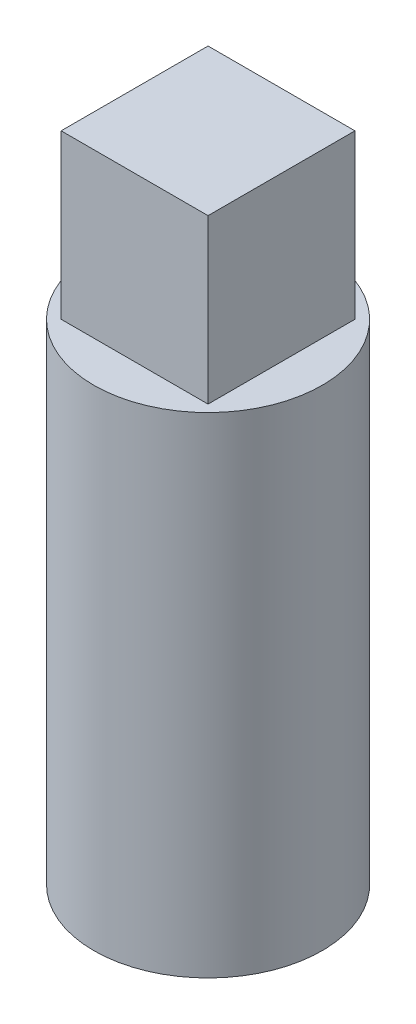
ISO-10303-21;
HEADER;
FILE_DESCRIPTION(('STEP AP214'),'2;1');
FILE_NAME('part.step','',(''),(''),'','','');
FILE_SCHEMA(('AUTOMOTIVE_DESIGN { 1 0 10303 214 1 1 1 1 }'));
ENDSEC;
DATA;
#1=APPLICATION_CONTEXT('core data for automotive mechanical design processes');
#2=APPLICATION_PROTOCOL_DEFINITION('international standard','automotive_design',2000,#1);
#3=PRODUCT_CONTEXT('',#1,'mechanical');
#4=PRODUCT('Part','Part','',(#3));
#5=PRODUCT_RELATED_PRODUCT_CATEGORY('part','',(#4));
#6=PRODUCT_DEFINITION_FORMATION('','',#4);
#7=PRODUCT_DEFINITION_CONTEXT('part definition',#1,'design');
#8=PRODUCT_DEFINITION('design','',#6,#7);
#9=PRODUCT_DEFINITION_SHAPE('','',#8);
#10=(LENGTH_UNIT() NAMED_UNIT(*) SI_UNIT(.MILLI.,.METRE.));
#11=(NAMED_UNIT(*) PLANE_ANGLE_UNIT() SI_UNIT($,.RADIAN.));
#12=(NAMED_UNIT(*) SI_UNIT($,.STERADIAN.) SOLID_ANGLE_UNIT());
#13=UNCERTAINTY_MEASURE_WITH_UNIT(LENGTH_MEASURE(1.E-05),#10,'distance_accuracy_value','');
#14=(GEOMETRIC_REPRESENTATION_CONTEXT(3) GLOBAL_UNCERTAINTY_ASSIGNED_CONTEXT((#13)) GLOBAL_UNIT_ASSIGNED_CONTEXT((#10,
#11,#12)) REPRESENTATION_CONTEXT('',''));
#15=CARTESIAN_POINT('',(0.,0.,0.));
#16=DIRECTION('',(0.,0.,1.));
#17=DIRECTION('',(1.,0.,0.));
#18=AXIS2_PLACEMENT_3D('',#15,#16,#17);
#19=CARTESIAN_POINT('',(0.,6.,0.));
#20=DIRECTION('',(0.,1.,0.));
#21=DIRECTION('',(0.,0.,1.));
#22=AXIS2_PLACEMENT_3D('',#19,#20,#21);
#23=PLANE('',#22);
#24=CARTESIAN_POINT('',(0.,6.,0.));
#25=DIRECTION('',(0.,1.,0.));
#26=DIRECTION('',(0.,0.,1.));
#27=AXIS2_PLACEMENT_3D('',#24,#25,#26);
#28=CIRCLE('',#27,1.4);
#29=CARTESIAN_POINT('',(0.,6.,1.4));
#30=VERTEX_POINT('',#29);
#31=EDGE_CURVE('E11',#30,#30,#28,.T.);
#32=ORIENTED_EDGE('',*,*,#31,.T.);
#33=EDGE_LOOP('',(#32));
#34=FACE_BOUND('',#33,.T.);
#35=DIRECTION('',(0.,0.,1.));
#36=VECTOR('',#35,1.);
#37=CARTESIAN_POINT('',(0.9,6.,0.));
#38=LINE('',#37,#36);
#39=CARTESIAN_POINT('',(0.9,6.,-0.9));
#40=VERTEX_POINT('',#39);
#41=CARTESIAN_POINT('',(0.9,6.,0.9));
#42=VERTEX_POINT('',#41);
#43=EDGE_CURVE('E100',#40,#42,#38,.T.);
#44=ORIENTED_EDGE('',*,*,#43,.T.);
#45=DIRECTION('',(-1.,0.,0.));
#46=VECTOR('',#45,1.);
#47=CARTESIAN_POINT('',(0.,6.,0.9));
#48=LINE('',#47,#46);
#49=CARTESIAN_POINT('',(-0.9,6.,0.9));
#50=VERTEX_POINT('',#49);
#51=EDGE_CURVE('E63',#42,#50,#48,.T.);
#52=ORIENTED_EDGE('',*,*,#51,.T.);
#53=DIRECTION('',(0.,0.,1.));
#54=VECTOR('',#53,1.);
#55=CARTESIAN_POINT('',(-0.9,6.,0.));
#56=LINE('',#55,#54);
#57=CARTESIAN_POINT('',(-0.9,6.,-0.9));
#58=VERTEX_POINT('',#57);
#59=EDGE_CURVE('E117',#58,#50,#56,.T.);
#60=ORIENTED_EDGE('',*,*,#59,.F.);
#61=DIRECTION('',(-1.,0.,0.));
#62=VECTOR('',#61,1.);
#63=CARTESIAN_POINT('',(0.,6.,-0.9));
#64=LINE('',#63,#62);
#65=EDGE_CURVE('E126',#40,#58,#64,.T.);
#66=ORIENTED_EDGE('',*,*,#65,.F.);
#67=EDGE_LOOP('',(#44,#52,#60,#66));
#68=FACE_BOUND('',#67,.T.);
#69=ADVANCED_FACE('F47',(#34,#68),#23,.T.);
#70=CARTESIAN_POINT('',(0.,6.,0.));
#71=DIRECTION('',(0.,-1.,0.));
#72=DIRECTION('',(0.,0.,-1.));
#73=AXIS2_PLACEMENT_3D('',#70,#71,#72);
#74=CYLINDRICAL_SURFACE('',#73,1.4);
#75=ORIENTED_EDGE('',*,*,#31,.F.);
#76=EDGE_LOOP('',(#75));
#77=FACE_BOUND('',#76,.T.);
#78=CARTESIAN_POINT('',(0.,0.,0.));
#79=DIRECTION('',(0.,1.,0.));
#80=DIRECTION('',(0.,0.,1.));
#81=AXIS2_PLACEMENT_3D('',#78,#79,#80);
#82=CIRCLE('',#81,1.4);
#83=CARTESIAN_POINT('',(0.,0.,1.4));
#84=VERTEX_POINT('',#83);
#85=EDGE_CURVE('E51',#84,#84,#82,.T.);
#86=ORIENTED_EDGE('',*,*,#85,.T.);
#87=EDGE_LOOP('',(#86));
#88=FACE_BOUND('',#87,.T.);
#89=ADVANCED_FACE('F49',(#77,#88),#74,.T.);
#90=CARTESIAN_POINT('',(0.,0.,0.));
#91=DIRECTION('',(0.,1.,0.));
#92=DIRECTION('',(0.,0.,1.));
#93=AXIS2_PLACEMENT_3D('',#90,#91,#92);
#94=PLANE('',#93);
#95=ORIENTED_EDGE('',*,*,#85,.F.);
#96=EDGE_LOOP('',(#95));
#97=FACE_BOUND('',#96,.T.);
#98=ADVANCED_FACE('F141',(#97),#94,.F.);
#99=CARTESIAN_POINT('',(0.,8.,0.9));
#100=DIRECTION('',(0.,0.,1.));
#101=DIRECTION('',(1.,0.,0.));
#102=AXIS2_PLACEMENT_3D('',#99,#100,#101);
#103=PLANE('',#102);
#104=ORIENTED_EDGE('',*,*,#51,.F.);
#105=DIRECTION('',(0.,-1.,0.));
#106=VECTOR('',#105,1.);
#107=CARTESIAN_POINT('',(0.9,8.,0.9));
#108=LINE('',#107,#106);
#109=CARTESIAN_POINT('',(0.9,8.,0.9));
#110=VERTEX_POINT('',#109);
#111=EDGE_CURVE('E89',#110,#42,#108,.T.);
#112=ORIENTED_EDGE('',*,*,#111,.F.);
#113=DIRECTION('',(-1.,0.,0.));
#114=VECTOR('',#113,1.);
#115=CARTESIAN_POINT('',(0.,8.,0.9));
#116=LINE('',#115,#114);
#117=CARTESIAN_POINT('',(-0.9,8.,0.9));
#118=VERTEX_POINT('',#117);
#119=EDGE_CURVE('E113',#110,#118,#116,.T.);
#120=ORIENTED_EDGE('',*,*,#119,.T.);
#121=DIRECTION('',(0.,-1.,0.));
#122=VECTOR('',#121,1.);
#123=CARTESIAN_POINT('',(-0.9,8.,0.9));
#124=LINE('',#123,#122);
#125=EDGE_CURVE('E86',#118,#50,#124,.T.);
#126=ORIENTED_EDGE('',*,*,#125,.T.);
#127=EDGE_LOOP('',(#104,#112,#120,#126));
#128=FACE_BOUND('',#127,.T.);
#129=ADVANCED_FACE('F143',(#128),#103,.T.);
#130=CARTESIAN_POINT('',(0.9,8.,0.));
#131=DIRECTION('',(1.,0.,0.));
#132=DIRECTION('',(0.,0.,-1.));
#133=AXIS2_PLACEMENT_3D('',#130,#131,#132);
#134=PLANE('',#133);
#135=ORIENTED_EDGE('',*,*,#43,.F.);
#136=DIRECTION('',(0.,-1.,0.));
#137=VECTOR('',#136,1.);
#138=CARTESIAN_POINT('',(0.9,8.,-0.9));
#139=LINE('',#138,#137);
#140=CARTESIAN_POINT('',(0.9,8.,-0.9));
#141=VERTEX_POINT('',#140);
#142=EDGE_CURVE('E94',#141,#40,#139,.T.);
#143=ORIENTED_EDGE('',*,*,#142,.F.);
#144=DIRECTION('',(0.,0.,1.));
#145=VECTOR('',#144,1.);
#146=CARTESIAN_POINT('',(0.9,8.,0.));
#147=LINE('',#146,#145);
#148=EDGE_CURVE('E98',#141,#110,#147,.T.);
#149=ORIENTED_EDGE('',*,*,#148,.T.);
#150=ORIENTED_EDGE('',*,*,#111,.T.);
#151=EDGE_LOOP('',(#135,#143,#149,#150));
#152=FACE_BOUND('',#151,.T.);
#153=ADVANCED_FACE('F96',(#152),#134,.T.);
#154=CARTESIAN_POINT('',(0.,8.,-0.9));
#155=DIRECTION('',(0.,0.,1.));
#156=DIRECTION('',(1.,0.,0.));
#157=AXIS2_PLACEMENT_3D('',#154,#155,#156);
#158=PLANE('',#157);
#159=ORIENTED_EDGE('',*,*,#65,.T.);
#160=DIRECTION('',(0.,-1.,0.));
#161=VECTOR('',#160,1.);
#162=CARTESIAN_POINT('',(-0.9,8.,-0.9));
#163=LINE('',#162,#161);
#164=CARTESIAN_POINT('',(-0.9,8.,-0.9));
#165=VERTEX_POINT('',#164);
#166=EDGE_CURVE('E104',#165,#58,#163,.T.);
#167=ORIENTED_EDGE('',*,*,#166,.F.);
#168=DIRECTION('',(-1.,0.,0.));
#169=VECTOR('',#168,1.);
#170=CARTESIAN_POINT('',(0.,8.,-0.9));
#171=LINE('',#170,#169);
#172=EDGE_CURVE('E107',#141,#165,#171,.T.);
#173=ORIENTED_EDGE('',*,*,#172,.F.);
#174=ORIENTED_EDGE('',*,*,#142,.T.);
#175=EDGE_LOOP('',(#159,#167,#173,#174));
#176=FACE_BOUND('',#175,.T.);
#177=ADVANCED_FACE('F108',(#176),#158,.F.);
#178=CARTESIAN_POINT('',(-0.9,8.,0.));
#179=DIRECTION('',(1.,0.,0.));
#180=DIRECTION('',(0.,0.,-1.));
#181=AXIS2_PLACEMENT_3D('',#178,#179,#180);
#182=PLANE('',#181);
#183=ORIENTED_EDGE('',*,*,#59,.T.);
#184=ORIENTED_EDGE('',*,*,#125,.F.);
#185=DIRECTION('',(0.,0.,1.));
#186=VECTOR('',#185,1.);
#187=CARTESIAN_POINT('',(-0.9,8.,0.));
#188=LINE('',#187,#186);
#189=EDGE_CURVE('E72',#165,#118,#188,.T.);
#190=ORIENTED_EDGE('',*,*,#189,.F.);
#191=ORIENTED_EDGE('',*,*,#166,.T.);
#192=EDGE_LOOP('',(#183,#184,#190,#191));
#193=FACE_BOUND('',#192,.T.);
#194=ADVANCED_FACE('F161',(#193),#182,.F.);
#195=CARTESIAN_POINT('',(0.,8.,0.));
#196=DIRECTION('',(0.,1.,0.));
#197=DIRECTION('',(0.,0.,1.));
#198=AXIS2_PLACEMENT_3D('',#195,#196,#197);
#199=PLANE('',#198);
#200=ORIENTED_EDGE('',*,*,#119,.F.);
#201=ORIENTED_EDGE('',*,*,#148,.F.);
#202=ORIENTED_EDGE('',*,*,#172,.T.);
#203=ORIENTED_EDGE('',*,*,#189,.T.);
#204=EDGE_LOOP('',(#200,#201,#202,#203));
#205=FACE_BOUND('',#204,.T.);
#206=ADVANCED_FACE('F112',(#205),#199,.T.);
#207=CLOSED_SHELL('',(#69,#89,#98,#129,#153,#177,#194,#206));
#208=MANIFOLD_SOLID_BREP('B2',#207);
#209=ADVANCED_BREP_SHAPE_REPRESENTATION('',(#18,#208),#14);
#210=SHAPE_DEFINITION_REPRESENTATION(#9,#209);
ENDSEC;
END-ISO-10303-21;
